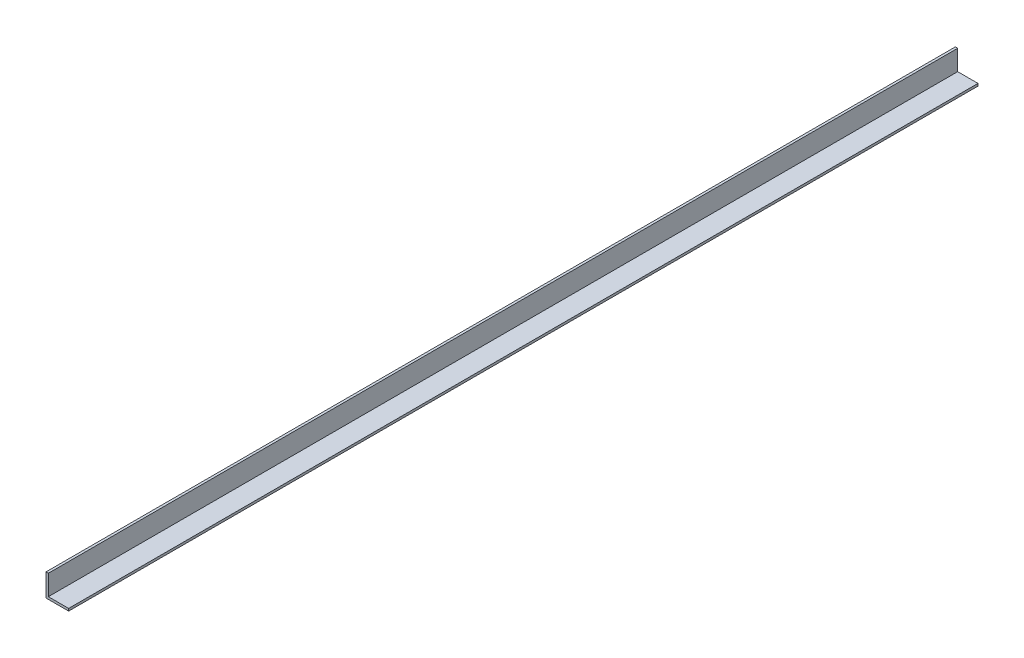
ISO-10303-21;
HEADER;
FILE_DESCRIPTION(('STEP AP214'),'2;1');
FILE_NAME('part.step','',(''),(''),'','','');
FILE_SCHEMA(('AUTOMOTIVE_DESIGN { 1 0 10303 214 1 1 1 1 }'));
ENDSEC;
DATA;
#1=APPLICATION_CONTEXT('core data for automotive mechanical design processes');
#2=APPLICATION_PROTOCOL_DEFINITION('international standard','automotive_design',2000,#1);
#3=PRODUCT_CONTEXT('',#1,'mechanical');
#4=PRODUCT('Part','Part','',(#3));
#5=PRODUCT_RELATED_PRODUCT_CATEGORY('part','',(#4));
#6=PRODUCT_DEFINITION_FORMATION('','',#4);
#7=PRODUCT_DEFINITION_CONTEXT('part definition',#1,'design');
#8=PRODUCT_DEFINITION('design','',#6,#7);
#9=PRODUCT_DEFINITION_SHAPE('','',#8);
#10=(LENGTH_UNIT() NAMED_UNIT(*) SI_UNIT(.MILLI.,.METRE.));
#11=(NAMED_UNIT(*) PLANE_ANGLE_UNIT() SI_UNIT($,.RADIAN.));
#12=(NAMED_UNIT(*) SI_UNIT($,.STERADIAN.) SOLID_ANGLE_UNIT());
#13=UNCERTAINTY_MEASURE_WITH_UNIT(LENGTH_MEASURE(1.E-05),#10,'distance_accuracy_value','');
#14=(GEOMETRIC_REPRESENTATION_CONTEXT(3) GLOBAL_UNCERTAINTY_ASSIGNED_CONTEXT((#13)) GLOBAL_UNIT_ASSIGNED_CONTEXT((#10,
#11,#12)) REPRESENTATION_CONTEXT('',''));
#15=CARTESIAN_POINT('',(0.,0.,0.));
#16=DIRECTION('',(0.,0.,1.));
#17=DIRECTION('',(1.,0.,0.));
#18=AXIS2_PLACEMENT_3D('',#15,#16,#17);
#19=CARTESIAN_POINT('',(15.88,152.,-6100.));
#20=DIRECTION('',(0.,1.,0.));
#21=DIRECTION('',(0.,0.,1.));
#22=AXIS2_PLACEMENT_3D('',#19,#20,#21);
#23=PLANE('',#22);
#24=DIRECTION('',(-1.,0.,0.));
#25=VECTOR('',#24,1.);
#26=CARTESIAN_POINT('',(15.88,152.,0.));
#27=LINE('',#26,#25);
#28=CARTESIAN_POINT('',(15.88,152.,0.));
#29=VERTEX_POINT('',#28);
#30=CARTESIAN_POINT('',(0.,152.,0.));
#31=VERTEX_POINT('',#30);
#32=EDGE_CURVE('E118',#29,#31,#27,.T.);
#33=ORIENTED_EDGE('',*,*,#32,.F.);
#34=DIRECTION('',(0.,0.,1.));
#35=VECTOR('',#34,1.);
#36=CARTESIAN_POINT('',(15.88,152.,-6100.));
#37=LINE('',#36,#35);
#38=CARTESIAN_POINT('',(15.88,152.,-6100.));
#39=VERTEX_POINT('',#38);
#40=EDGE_CURVE('E11',#39,#29,#37,.T.);
#41=ORIENTED_EDGE('',*,*,#40,.F.);
#42=DIRECTION('',(-1.,0.,0.));
#43=VECTOR('',#42,1.);
#44=CARTESIAN_POINT('',(15.88,152.,-6100.));
#45=LINE('',#44,#43);
#46=CARTESIAN_POINT('',(0.,152.,-6100.));
#47=VERTEX_POINT('',#46);
#48=EDGE_CURVE('E132',#39,#47,#45,.T.);
#49=ORIENTED_EDGE('',*,*,#48,.T.);
#50=DIRECTION('',(0.,0.,1.));
#51=VECTOR('',#50,1.);
#52=CARTESIAN_POINT('',(0.,152.,-6100.));
#53=LINE('',#52,#51);
#54=EDGE_CURVE('E36',#47,#31,#53,.T.);
#55=ORIENTED_EDGE('',*,*,#54,.T.);
#56=EDGE_LOOP('',(#33,#41,#49,#55));
#57=FACE_BOUND('',#56,.T.);
#58=ADVANCED_FACE('F33',(#57),#23,.T.);
#59=CARTESIAN_POINT('',(15.88,15.88,-6100.));
#60=DIRECTION('',(1.,0.,0.));
#61=DIRECTION('',(0.,1.,0.));
#62=AXIS2_PLACEMENT_3D('',#59,#60,#61);
#63=PLANE('',#62);
#64=DIRECTION('',(0.,1.,0.));
#65=VECTOR('',#64,1.);
#66=CARTESIAN_POINT('',(15.88,15.88,0.));
#67=LINE('',#66,#65);
#68=CARTESIAN_POINT('',(15.88,15.88,0.));
#69=VERTEX_POINT('',#68);
#70=EDGE_CURVE('E130',#69,#29,#67,.T.);
#71=ORIENTED_EDGE('',*,*,#70,.F.);
#72=DIRECTION('',(0.,0.,1.));
#73=VECTOR('',#72,1.);
#74=CARTESIAN_POINT('',(15.88,15.88,-6100.));
#75=LINE('',#74,#73);
#76=CARTESIAN_POINT('',(15.88,15.88,-6100.));
#77=VERTEX_POINT('',#76);
#78=EDGE_CURVE('E42',#77,#69,#75,.T.);
#79=ORIENTED_EDGE('',*,*,#78,.F.);
#80=DIRECTION('',(0.,1.,0.));
#81=VECTOR('',#80,1.);
#82=CARTESIAN_POINT('',(15.88,15.88,-6100.));
#83=LINE('',#82,#81);
#84=EDGE_CURVE('E108',#77,#39,#83,.T.);
#85=ORIENTED_EDGE('',*,*,#84,.T.);
#86=ORIENTED_EDGE('',*,*,#40,.T.);
#87=EDGE_LOOP('',(#71,#79,#85,#86));
#88=FACE_BOUND('',#87,.T.);
#89=ADVANCED_FACE('F140',(#88),#63,.T.);
#90=CARTESIAN_POINT('',(152.,15.88,-6100.));
#91=DIRECTION('',(0.,1.,0.));
#92=DIRECTION('',(-1.,0.,0.));
#93=AXIS2_PLACEMENT_3D('',#90,#91,#92);
#94=PLANE('',#93);
#95=DIRECTION('',(-1.,0.,0.));
#96=VECTOR('',#95,1.);
#97=CARTESIAN_POINT('',(152.,15.88,0.));
#98=LINE('',#97,#96);
#99=CARTESIAN_POINT('',(152.,15.88,0.));
#100=VERTEX_POINT('',#99);
#101=EDGE_CURVE('E95',#100,#69,#98,.T.);
#102=ORIENTED_EDGE('',*,*,#101,.F.);
#103=DIRECTION('',(0.,0.,1.));
#104=VECTOR('',#103,1.);
#105=CARTESIAN_POINT('',(152.,15.88,-6100.));
#106=LINE('',#105,#104);
#107=CARTESIAN_POINT('',(152.,15.88,-6100.));
#108=VERTEX_POINT('',#107);
#109=EDGE_CURVE('E90',#108,#100,#106,.T.);
#110=ORIENTED_EDGE('',*,*,#109,.F.);
#111=DIRECTION('',(-1.,0.,0.));
#112=VECTOR('',#111,1.);
#113=CARTESIAN_POINT('',(152.,15.88,-6100.));
#114=LINE('',#113,#112);
#115=EDGE_CURVE('E93',#108,#77,#114,.T.);
#116=ORIENTED_EDGE('',*,*,#115,.T.);
#117=ORIENTED_EDGE('',*,*,#78,.T.);
#118=EDGE_LOOP('',(#102,#110,#116,#117));
#119=FACE_BOUND('',#118,.T.);
#120=ADVANCED_FACE('F92',(#119),#94,.T.);
#121=CARTESIAN_POINT('',(152.,0.,-6100.));
#122=DIRECTION('',(1.,0.,0.));
#123=DIRECTION('',(0.,0.,-1.));
#124=AXIS2_PLACEMENT_3D('',#121,#122,#123);
#125=PLANE('',#124);
#126=DIRECTION('',(0.,1.,0.));
#127=VECTOR('',#126,1.);
#128=CARTESIAN_POINT('',(152.,0.,0.));
#129=LINE('',#128,#127);
#130=CARTESIAN_POINT('',(152.,0.,0.));
#131=VERTEX_POINT('',#130);
#132=EDGE_CURVE('E127',#131,#100,#129,.T.);
#133=ORIENTED_EDGE('',*,*,#132,.F.);
#134=DIRECTION('',(0.,0.,1.));
#135=VECTOR('',#134,1.);
#136=CARTESIAN_POINT('',(152.,0.,-6100.));
#137=LINE('',#136,#135);
#138=CARTESIAN_POINT('',(152.,0.,-6100.));
#139=VERTEX_POINT('',#138);
#140=EDGE_CURVE('E100',#139,#131,#137,.T.);
#141=ORIENTED_EDGE('',*,*,#140,.F.);
#142=DIRECTION('',(0.,1.,0.));
#143=VECTOR('',#142,1.);
#144=CARTESIAN_POINT('',(152.,0.,-6100.));
#145=LINE('',#144,#143);
#146=EDGE_CURVE('E106',#139,#108,#145,.T.);
#147=ORIENTED_EDGE('',*,*,#146,.T.);
#148=ORIENTED_EDGE('',*,*,#109,.T.);
#149=EDGE_LOOP('',(#133,#141,#147,#148));
#150=FACE_BOUND('',#149,.T.);
#151=ADVANCED_FACE('F110',(#150),#125,.T.);
#152=CARTESIAN_POINT('',(0.,0.,-6100.));
#153=DIRECTION('',(0.,-1.,0.));
#154=DIRECTION('',(0.,0.,-1.));
#155=AXIS2_PLACEMENT_3D('',#152,#153,#154);
#156=PLANE('',#155);
#157=DIRECTION('',(1.,0.,0.));
#158=VECTOR('',#157,1.);
#159=CARTESIAN_POINT('',(0.,0.,0.));
#160=LINE('',#159,#158);
#161=CARTESIAN_POINT('',(0.,0.,0.));
#162=VERTEX_POINT('',#161);
#163=EDGE_CURVE('E124',#162,#131,#160,.T.);
#164=ORIENTED_EDGE('',*,*,#163,.F.);
#165=DIRECTION('',(0.,0.,1.));
#166=VECTOR('',#165,1.);
#167=CARTESIAN_POINT('',(0.,0.,-6100.));
#168=LINE('',#167,#166);
#169=CARTESIAN_POINT('',(0.,0.,-6100.));
#170=VERTEX_POINT('',#169);
#171=EDGE_CURVE('E135',#170,#162,#168,.T.);
#172=ORIENTED_EDGE('',*,*,#171,.F.);
#173=DIRECTION('',(1.,0.,0.));
#174=VECTOR('',#173,1.);
#175=CARTESIAN_POINT('',(0.,0.,-6100.));
#176=LINE('',#175,#174);
#177=EDGE_CURVE('E111',#170,#139,#176,.T.);
#178=ORIENTED_EDGE('',*,*,#177,.T.);
#179=ORIENTED_EDGE('',*,*,#140,.T.);
#180=EDGE_LOOP('',(#164,#172,#178,#179));
#181=FACE_BOUND('',#180,.T.);
#182=ADVANCED_FACE('F153',(#181),#156,.T.);
#183=CARTESIAN_POINT('',(0.,152.,-6100.));
#184=DIRECTION('',(-1.,0.,0.));
#185=DIRECTION('',(0.,-1.,0.));
#186=AXIS2_PLACEMENT_3D('',#183,#184,#185);
#187=PLANE('',#186);
#188=DIRECTION('',(0.,-1.,0.));
#189=VECTOR('',#188,1.);
#190=CARTESIAN_POINT('',(0.,152.,0.));
#191=LINE('',#190,#189);
#192=EDGE_CURVE('E121',#31,#162,#191,.T.);
#193=ORIENTED_EDGE('',*,*,#192,.F.);
#194=ORIENTED_EDGE('',*,*,#54,.F.);
#195=DIRECTION('',(0.,-1.,0.));
#196=VECTOR('',#195,1.);
#197=CARTESIAN_POINT('',(0.,152.,-6100.));
#198=LINE('',#197,#196);
#199=EDGE_CURVE('E113',#47,#170,#198,.T.);
#200=ORIENTED_EDGE('',*,*,#199,.T.);
#201=ORIENTED_EDGE('',*,*,#171,.T.);
#202=EDGE_LOOP('',(#193,#194,#200,#201));
#203=FACE_BOUND('',#202,.T.);
#204=ADVANCED_FACE('F137',(#203),#187,.T.);
#205=CARTESIAN_POINT('',(0.,0.,-6100.));
#206=DIRECTION('',(0.,0.,1.));
#207=DIRECTION('',(1.,0.,0.));
#208=AXIS2_PLACEMENT_3D('',#205,#206,#207);
#209=PLANE('',#208);
#210=ORIENTED_EDGE('',*,*,#48,.F.);
#211=ORIENTED_EDGE('',*,*,#84,.F.);
#212=ORIENTED_EDGE('',*,*,#115,.F.);
#213=ORIENTED_EDGE('',*,*,#146,.F.);
#214=ORIENTED_EDGE('',*,*,#177,.F.);
#215=ORIENTED_EDGE('',*,*,#199,.F.);
#216=EDGE_LOOP('',(#210,#211,#212,#213,#214,#215));
#217=FACE_BOUND('',#216,.T.);
#218=ADVANCED_FACE('F104',(#217),#209,.F.);
#219=CARTESIAN_POINT('',(0.,0.,0.));
#220=DIRECTION('',(0.,0.,1.));
#221=DIRECTION('',(1.,0.,0.));
#222=AXIS2_PLACEMENT_3D('',#219,#220,#221);
#223=PLANE('',#222);
#224=ORIENTED_EDGE('',*,*,#32,.T.);
#225=ORIENTED_EDGE('',*,*,#192,.T.);
#226=ORIENTED_EDGE('',*,*,#163,.T.);
#227=ORIENTED_EDGE('',*,*,#132,.T.);
#228=ORIENTED_EDGE('',*,*,#101,.T.);
#229=ORIENTED_EDGE('',*,*,#70,.T.);
#230=EDGE_LOOP('',(#224,#225,#226,#227,#228,#229));
#231=FACE_BOUND('',#230,.T.);
#232=ADVANCED_FACE('F139',(#231),#223,.T.);
#233=CLOSED_SHELL('',(#58,#89,#120,#151,#182,#204,#218,#232));
#234=MANIFOLD_SOLID_BREP('B2',#233);
#235=ADVANCED_BREP_SHAPE_REPRESENTATION('',(#18,#234),#14);
#236=SHAPE_DEFINITION_REPRESENTATION(#9,#235);
ENDSEC;
END-ISO-10303-21;
